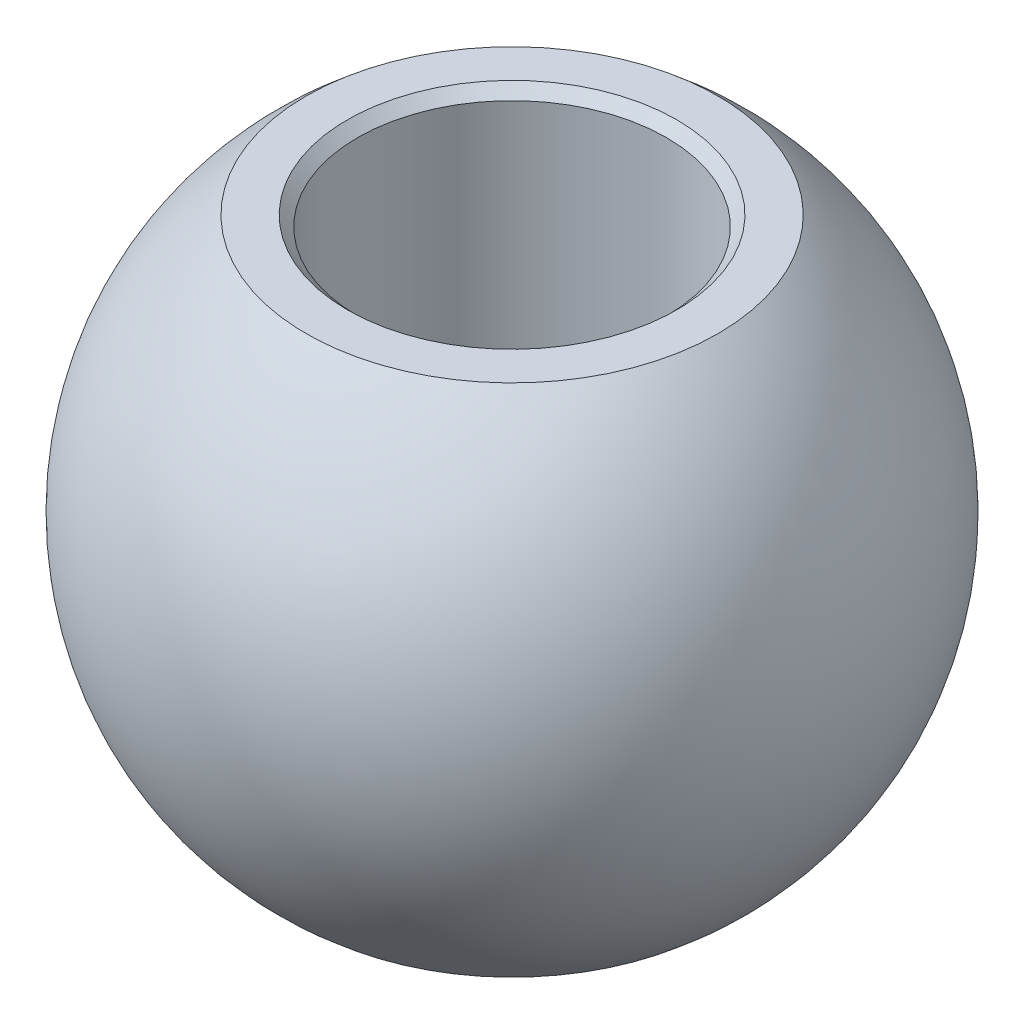
ISO-10303-21;
HEADER;
FILE_DESCRIPTION(('STEP AP214'),'2;1');
FILE_NAME('part.step','',(''),(''),'','','');
FILE_SCHEMA(('AUTOMOTIVE_DESIGN { 1 0 10303 214 1 1 1 1 }'));
ENDSEC;
DATA;
#1=APPLICATION_CONTEXT('core data for automotive mechanical design processes');
#2=APPLICATION_PROTOCOL_DEFINITION('international standard','automotive_design',2000,#1);
#3=PRODUCT_CONTEXT('',#1,'mechanical');
#4=PRODUCT('Part','Part','',(#3));
#5=PRODUCT_RELATED_PRODUCT_CATEGORY('part','',(#4));
#6=PRODUCT_DEFINITION_FORMATION('','',#4);
#7=PRODUCT_DEFINITION_CONTEXT('part definition',#1,'design');
#8=PRODUCT_DEFINITION('design','',#6,#7);
#9=PRODUCT_DEFINITION_SHAPE('','',#8);
#10=(LENGTH_UNIT() NAMED_UNIT(*) SI_UNIT(.MILLI.,.METRE.));
#11=(NAMED_UNIT(*) PLANE_ANGLE_UNIT() SI_UNIT($,.RADIAN.));
#12=(NAMED_UNIT(*) SI_UNIT($,.STERADIAN.) SOLID_ANGLE_UNIT());
#13=UNCERTAINTY_MEASURE_WITH_UNIT(LENGTH_MEASURE(1.E-05),#10,'distance_accuracy_value','');
#14=(GEOMETRIC_REPRESENTATION_CONTEXT(3) GLOBAL_UNCERTAINTY_ASSIGNED_CONTEXT((#13)) GLOBAL_UNIT_ASSIGNED_CONTEXT((#10,
#11,#12)) REPRESENTATION_CONTEXT('',''));
#15=CARTESIAN_POINT('',(0.,0.,0.));
#16=DIRECTION('',(0.,0.,1.));
#17=DIRECTION('',(1.,0.,0.));
#18=AXIS2_PLACEMENT_3D('',#15,#16,#17);
#19=CARTESIAN_POINT('',(0.,0.,0.));
#20=DIRECTION('',(0.,1.,0.));
#21=DIRECTION('',(0.,0.,1.));
#22=AXIS2_PLACEMENT_3D('',#19,#20,#21);
#23=PLANE('',#22);
#24=CARTESIAN_POINT('',(0.,0.,0.));
#25=DIRECTION('',(0.,1.,0.));
#26=DIRECTION('',(0.,0.,1.));
#27=AXIS2_PLACEMENT_3D('',#24,#25,#26);
#28=CIRCLE('',#27,1.6);
#29=CARTESIAN_POINT('',(0.,0.,-1.6));
#30=VERTEX_POINT('',#29);
#31=EDGE_CURVE('E10',#30,#30,#28,.T.);
#32=ORIENTED_EDGE('',*,*,#31,.T.);
#33=EDGE_LOOP('',(#32));
#34=FACE_BOUND('',#33,.T.);
#35=CARTESIAN_POINT('',(0.,0.,0.));
#36=DIRECTION('',(0.,1.,0.));
#37=DIRECTION('',(0.,0.,1.));
#38=AXIS2_PLACEMENT_3D('',#35,#36,#37);
#39=CIRCLE('',#38,2.);
#40=CARTESIAN_POINT('',(2.,0.,0.));
#41=VERTEX_POINT('',#40);
#42=EDGE_CURVE('E50',#41,#41,#39,.T.);
#43=ORIENTED_EDGE('',*,*,#42,.F.);
#44=EDGE_LOOP('',(#43));
#45=FACE_BOUND('',#44,.T.);
#46=ADVANCED_FACE('F30',(#34,#45),#23,.F.);
#47=CARTESIAN_POINT('',(0.,2.5,0.));
#48=DIRECTION('',(0.,1.,0.));
#49=DIRECTION('',(1.,0.,0.));
#50=AXIS2_PLACEMENT_3D('',#47,#48,#49);
#51=SPHERICAL_SURFACE('',#50,3.20156211871642);
#52=CARTESIAN_POINT('',(0.,5.,0.));
#53=DIRECTION('',(0.,1.,0.));
#54=DIRECTION('',(0.,0.,1.));
#55=AXIS2_PLACEMENT_3D('',#52,#53,#54);
#56=CIRCLE('',#55,2.);
#57=CARTESIAN_POINT('',(2.,5.,0.));
#58=VERTEX_POINT('',#57);
#59=EDGE_CURVE('E53',#58,#58,#56,.T.);
#60=CARTESIAN_POINT('',(2.,5.,0.));
#61=CARTESIAN_POINT('',(2.04667080680688,4.96266576471709,0.));
#62=CARTESIAN_POINT('',(2.09229369871325,4.9240219283492,0.));
#63=CARTESIAN_POINT('',(2.18130612201967,4.84424238607713,0.));
#64=CARTESIAN_POINT('',(2.22469565341971,4.80310668017295,0.));
#65=CARTESIAN_POINT('',(2.30910382500815,4.71847073146198,0.));
#66=CARTESIAN_POINT('',(2.35012246519655,4.67497048865518,0.));
#67=CARTESIAN_POINT('',(2.42966063415613,4.58574230654031,0.));
#68=CARTESIAN_POINT('',(2.46818016292731,4.54001436723223,0.));
#69=CARTESIAN_POINT('',(2.54259922219851,4.44647405663133,0.));
#70=CARTESIAN_POINT('',(2.57849875269853,4.3986616853385,0.));
#71=CARTESIAN_POINT('',(2.64756527847642,4.30110246147674,0.));
#72=CARTESIAN_POINT('',(2.68073227375429,4.25135560890782,0.));
#73=CARTESIAN_POINT('',(2.74422972408889,4.15008339862375,0.));
#74=CARTESIAN_POINT('',(2.77456017914562,4.0985580409086,0.));
#75=CARTESIAN_POINT('',(2.83228944787627,3.99389038387791,0.));
#76=CARTESIAN_POINT('',(2.85968826155019,3.94074808456236,0.));
#77=CARTESIAN_POINT('',(2.9114683361229,3.83301317501538,0.));
#78=CARTESIAN_POINT('',(2.93584959702169,3.77842056478395,0.));
#79=CARTESIAN_POINT('',(2.98151811708827,3.66795621241311,0.));
#80=CARTESIAN_POINT('',(3.00280537625608,3.61208447027371,0.));
#81=CARTESIAN_POINT('',(3.04221914517177,3.49923704369237,0.));
#82=CARTESIAN_POINT('',(3.06034565491965,3.44226135925043,0.));
#83=CARTESIAN_POINT('',(3.09338108810127,3.32738469921129,0.));
#84=CARTESIAN_POINT('',(3.10829001153502,3.26948372361409,0.));
#85=CARTESIAN_POINT('',(3.13484352414164,3.15293803371017,0.));
#86=CARTESIAN_POINT('',(3.14648811331451,3.09429331940346,0.));
#87=CARTESIAN_POINT('',(3.16647644499843,2.97644403657359,0.));
#88=CARTESIAN_POINT('',(3.17482018750947,2.91723946805043,0.));
#89=CARTESIAN_POINT('',(3.18818066349712,2.79845611674067,0.));
#90=CARTESIAN_POINT('',(3.19319739697372,2.73887733395406,0.));
#91=CARTESIAN_POINT('',(3.19988812458338,2.61953236744497,0.));
#92=CARTESIAN_POINT('',(3.20156211871642,2.55976618372248,0.));
#93=CARTESIAN_POINT('',(3.20156211871642,2.44023381627751,0.));
#94=CARTESIAN_POINT('',(3.19988812458338,2.38046763255503,0.));
#95=CARTESIAN_POINT('',(3.19319739697372,2.26112266604594,0.));
#96=CARTESIAN_POINT('',(3.18818066349712,2.20154388325933,0.));
#97=CARTESIAN_POINT('',(3.17482018750947,2.08276053194957,0.));
#98=CARTESIAN_POINT('',(3.16647644499843,2.02355596342641,0.));
#99=CARTESIAN_POINT('',(3.14648811331451,1.90570668059654,0.));
#100=CARTESIAN_POINT('',(3.13484352414164,1.84706196628982,0.));
#101=CARTESIAN_POINT('',(3.10829001153502,1.73051627638591,0.));
#102=CARTESIAN_POINT('',(3.09338108810127,1.67261530078871,0.));
#103=CARTESIAN_POINT('',(3.06034565491965,1.55773864074957,0.));
#104=CARTESIAN_POINT('',(3.04221914517177,1.50076295630763,0.));
#105=CARTESIAN_POINT('',(3.00280537625608,1.38791552972629,0.));
#106=CARTESIAN_POINT('',(2.98151811708827,1.33204378758689,0.));
#107=CARTESIAN_POINT('',(2.93584959702168,1.22157943521605,0.));
#108=CARTESIAN_POINT('',(2.9114683361229,1.16698682498462,0.));
#109=CARTESIAN_POINT('',(2.85968826155019,1.05925191543764,0.));
#110=CARTESIAN_POINT('',(2.83228944787627,1.00610961612209,0.));
#111=CARTESIAN_POINT('',(2.77456017914561,0.901441959091396,0.));
#112=CARTESIAN_POINT('',(2.74422972408889,0.849916601376249,0.));
#113=CARTESIAN_POINT('',(2.68073227375429,0.748644391092179,0.));
#114=CARTESIAN_POINT('',(2.64756527847642,0.698897538523255,0.));
#115=CARTESIAN_POINT('',(2.57849875269852,0.601338314661502,0.));
#116=CARTESIAN_POINT('',(2.54259922219851,0.553525943368672,0.));
#117=CARTESIAN_POINT('',(2.46818016292731,0.459985632767766,0.));
#118=CARTESIAN_POINT('',(2.42966063415612,0.41425769345969,0.));
#119=CARTESIAN_POINT('',(2.35012246519655,0.325029511344817,0.));
#120=CARTESIAN_POINT('',(2.30910382500815,0.281529268538019,0.));
#121=CARTESIAN_POINT('',(2.22469565341971,0.196893319827044,0.));
#122=CARTESIAN_POINT('',(2.18130612201966,0.155757613922866,0.));
#123=CARTESIAN_POINT('',(2.09229369871325,0.075978071650799,0.));
#124=CARTESIAN_POINT('',(2.04667080680687,0.0373342352829097,0.));
#125=CARTESIAN_POINT('',(2.,0.,0.));
#126=B_SPLINE_CURVE_WITH_KNOTS('',3,(#60,#61,#62,#63,#64,#65,#66,#67,#68,#69,#70,#71,#72,#73,
#74,#75,#76,#77,#78,#79,#80,#81,#82,#83,#84,#85,#86,#87,#88,#89,#90,#91,#92,#93,#94,#95,#96,#97,
#98,#99,#100,#101,#102,#103,#104,#105,#106,#107,#108,#109,#110,#111,#112,#113,#114,#115,#116,
#117,#118,#119,#120,#121,#122,#123,#124,#125),.UNSPECIFIED.,.F.,.F.,(4,2,2,2,2,2,2,2,2,2,2,2,2,
2,2,2,2,2,2,2,2,2,2,2,2,2,2,2,2,2,2,2,4),(0.,0.17927513064657,0.358550261293141,
0.537825391939711,0.717100522586283,0.896375653232853,1.07565078387942,1.254925914526,
1.43420104517257,1.61347617581914,1.79275130646571,1.97202643711228,2.15130156775885,
2.33057669840542,2.50985182905199,2.68912695969856,2.86840209034513,3.0476772209917,
3.22695235163827,3.40622748228484,3.58550261293142,3.76477774357799,3.94405287422456,
4.12332800487113,4.3026031355177,4.48187826616427,4.66115339681084,4.84042852745741,
5.01970365810398,5.19897878875055,5.37825391939712,5.55752905004369,5.73680418069026),.UNSPECIFIED.);
#127=EDGE_CURVE('BSEAM59',#58,#41,#126,.T.);
#128=ORIENTED_EDGE('',*,*,#59,.F.);
#129=ORIENTED_EDGE('',*,*,#42,.T.);
#130=ORIENTED_EDGE('',*,*,#127,.T.);
#131=ORIENTED_EDGE('',*,*,#127,.F.);
#132=EDGE_LOOP('',(#128,#130,#129,#131));
#133=FACE_BOUND('',#132,.T.);
#134=ADVANCED_FACE('F59',(#133),#51,.T.);
#135=CARTESIAN_POINT('',(0.,5.,0.));
#136=DIRECTION('',(0.,-1.,0.));
#137=DIRECTION('',(0.,0.,-1.));
#138=AXIS2_PLACEMENT_3D('',#135,#136,#137);
#139=PLANE('',#138);
#140=CARTESIAN_POINT('',(0.,5.,0.));
#141=DIRECTION('',(0.,-1.,0.));
#142=DIRECTION('',(0.,0.,-1.));
#143=AXIS2_PLACEMENT_3D('',#140,#141,#142);
#144=CIRCLE('',#143,1.6);
#145=CARTESIAN_POINT('',(0.,5.,-1.6));
#146=VERTEX_POINT('',#145);
#147=EDGE_CURVE('E37',#146,#146,#144,.T.);
#148=ORIENTED_EDGE('',*,*,#147,.T.);
#149=EDGE_LOOP('',(#148));
#150=FACE_BOUND('',#149,.T.);
#151=ORIENTED_EDGE('',*,*,#59,.T.);
#152=EDGE_LOOP('',(#151));
#153=FACE_BOUND('',#152,.T.);
#154=ADVANCED_FACE('F57',(#150,#153),#139,.F.);
#155=CARTESIAN_POINT('',(0.,0.,0.));
#156=DIRECTION('',(0.,1.,0.));
#157=DIRECTION('',(0.,0.,1.));
#158=AXIS2_PLACEMENT_3D('',#155,#156,#157);
#159=CYLINDRICAL_SURFACE('',#158,1.5);
#160=CARTESIAN_POINT('',(0.,4.9,0.));
#161=DIRECTION('',(0.,-1.,0.));
#162=DIRECTION('',(0.,0.,-1.));
#163=AXIS2_PLACEMENT_3D('',#160,#161,#162);
#164=CIRCLE('',#163,1.5);
#165=CARTESIAN_POINT('',(0.,4.9,-1.5));
#166=VERTEX_POINT('',#165);
#167=EDGE_CURVE('E41',#166,#166,#164,.F.);
#168=ORIENTED_EDGE('',*,*,#167,.T.);
#169=EDGE_LOOP('',(#168));
#170=FACE_BOUND('',#169,.T.);
#171=CARTESIAN_POINT('',(0.,0.0999999999999994,0.));
#172=DIRECTION('',(0.,1.,0.));
#173=DIRECTION('',(0.,0.,1.));
#174=AXIS2_PLACEMENT_3D('',#171,#172,#173);
#175=CIRCLE('',#174,1.5);
#176=CARTESIAN_POINT('',(0.,0.0999999999999994,-1.5));
#177=VERTEX_POINT('',#176);
#178=EDGE_CURVE('E45',#177,#177,#175,.F.);
#179=ORIENTED_EDGE('',*,*,#178,.T.);
#180=EDGE_LOOP('',(#179));
#181=FACE_BOUND('',#180,.T.);
#182=ADVANCED_FACE('F72',(#170,#181),#159,.F.);
#183=CARTESIAN_POINT('',(0.,4.9,0.));
#184=DIRECTION('',(0.,1.,0.));
#185=DIRECTION('',(0.,0.,1.));
#186=AXIS2_PLACEMENT_3D('',#183,#184,#185);
#187=CONICAL_SURFACE('',#186,1.5,0.785398163397441);
#188=ORIENTED_EDGE('',*,*,#147,.F.);
#189=EDGE_LOOP('',(#188));
#190=FACE_BOUND('',#189,.T.);
#191=ORIENTED_EDGE('',*,*,#167,.F.);
#192=EDGE_LOOP('',(#191));
#193=FACE_BOUND('',#192,.T.);
#194=ADVANCED_FACE('F70',(#190,#193),#187,.F.);
#195=CARTESIAN_POINT('',(0.,0.,0.));
#196=DIRECTION('',(0.,-1.,0.));
#197=DIRECTION('',(0.,0.,-1.));
#198=AXIS2_PLACEMENT_3D('',#195,#196,#197);
#199=CONICAL_SURFACE('',#198,1.6,0.785398163397446);
#200=CARTESIAN_POINT('',(0.,0.0999999999999994,-1.5));
#201=CARTESIAN_POINT('',(0.,0.0989583333333327,-1.50104166666667));
#202=CARTESIAN_POINT('',(0.,0.097916666666666,-1.50208333333333));
#203=CARTESIAN_POINT('',(0.,0.0958333333333328,-1.50416666666667));
#204=CARTESIAN_POINT('',(0.,0.0947916666666661,-1.50520833333333));
#205=CARTESIAN_POINT('',(0.,0.0927083333333328,-1.50729166666667));
#206=CARTESIAN_POINT('',(0.,0.0916666666666661,-1.50833333333333));
#207=CARTESIAN_POINT('',(0.,0.0895833333333327,-1.51041666666667));
#208=CARTESIAN_POINT('',(0.,0.0885416666666661,-1.51145833333333));
#209=CARTESIAN_POINT('',(0.,0.0864583333333328,-1.51354166666667));
#210=CARTESIAN_POINT('',(0.,0.0854166666666661,-1.51458333333333));
#211=CARTESIAN_POINT('',(0.,0.0833333333333327,-1.51666666666667));
#212=CARTESIAN_POINT('',(0.,0.0822916666666661,-1.51770833333333));
#213=CARTESIAN_POINT('',(0.,0.0802083333333328,-1.51979166666667));
#214=CARTESIAN_POINT('',(0.,0.0791666666666661,-1.52083333333333));
#215=CARTESIAN_POINT('',(0.,0.0770833333333328,-1.52291666666667));
#216=CARTESIAN_POINT('',(0.,0.0760416666666661,-1.52395833333333));
#217=CARTESIAN_POINT('',(0.,0.0739583333333328,-1.52604166666667));
#218=CARTESIAN_POINT('',(0.,0.0729166666666661,-1.52708333333333));
#219=CARTESIAN_POINT('',(0.,0.0708333333333328,-1.52916666666667));
#220=CARTESIAN_POINT('',(0.,0.0697916666666661,-1.53020833333333));
#221=CARTESIAN_POINT('',(0.,0.0677083333333328,-1.53229166666667));
#222=CARTESIAN_POINT('',(0.,0.0666666666666661,-1.53333333333333));
#223=CARTESIAN_POINT('',(0.,0.0645833333333328,-1.53541666666667));
#224=CARTESIAN_POINT('',(0.,0.0635416666666661,-1.53645833333333));
#225=CARTESIAN_POINT('',(0.,0.0614583333333328,-1.53854166666667));
#226=CARTESIAN_POINT('',(0.,0.0604166666666661,-1.53958333333333));
#227=CARTESIAN_POINT('',(0.,0.0583333333333328,-1.54166666666667));
#228=CARTESIAN_POINT('',(0.,0.0572916666666662,-1.54270833333333));
#229=CARTESIAN_POINT('',(0.,0.0552083333333328,-1.54479166666667));
#230=CARTESIAN_POINT('',(0.,0.0541666666666661,-1.54583333333333));
#231=CARTESIAN_POINT('',(0.,0.0520833333333328,-1.54791666666667));
#232=CARTESIAN_POINT('',(0.,0.0510416666666662,-1.54895833333333));
#233=CARTESIAN_POINT('',(0.,0.0489583333333328,-1.55104166666667));
#234=CARTESIAN_POINT('',(0.,0.0479166666666661,-1.55208333333333));
#235=CARTESIAN_POINT('',(0.,0.0458333333333328,-1.55416666666667));
#236=CARTESIAN_POINT('',(0.,0.0447916666666662,-1.55520833333333));
#237=CARTESIAN_POINT('',(0.,0.0427083333333328,-1.55729166666667));
#238=CARTESIAN_POINT('',(0.,0.0416666666666662,-1.55833333333333));
#239=CARTESIAN_POINT('',(0.,0.0395833333333328,-1.56041666666667));
#240=CARTESIAN_POINT('',(0.,0.0385416666666662,-1.56145833333333));
#241=CARTESIAN_POINT('',(0.,0.0364583333333329,-1.56354166666667));
#242=CARTESIAN_POINT('',(0.,0.0354166666666662,-1.56458333333333));
#243=CARTESIAN_POINT('',(0.,0.0333333333333328,-1.56666666666667));
#244=CARTESIAN_POINT('',(0.,0.0322916666666662,-1.56770833333333));
#245=CARTESIAN_POINT('',(0.,0.0302083333333329,-1.56979166666667));
#246=CARTESIAN_POINT('',(0.,0.0291666666666662,-1.57083333333333));
#247=CARTESIAN_POINT('',(0.,0.0270833333333328,-1.57291666666667));
#248=CARTESIAN_POINT('',(0.,0.0260416666666662,-1.57395833333333));
#249=CARTESIAN_POINT('',(0.,0.0239583333333329,-1.57604166666667));
#250=CARTESIAN_POINT('',(0.,0.0229166666666662,-1.57708333333333));
#251=CARTESIAN_POINT('',(0.,0.0208333333333329,-1.57916666666667));
#252=CARTESIAN_POINT('',(0.,0.0197916666666662,-1.58020833333333));
#253=CARTESIAN_POINT('',(0.,0.0177083333333329,-1.58229166666667));
#254=CARTESIAN_POINT('',(0.,0.0166666666666662,-1.58333333333333));
#255=CARTESIAN_POINT('',(0.,0.0145833333333329,-1.58541666666667));
#256=CARTESIAN_POINT('',(0.,0.0135416666666662,-1.58645833333333));
#257=CARTESIAN_POINT('',(0.,0.0114583333333329,-1.58854166666667));
#258=CARTESIAN_POINT('',(0.,0.0104166666666662,-1.58958333333333));
#259=CARTESIAN_POINT('',(0.,0.0083333333333329,-1.59166666666667));
#260=CARTESIAN_POINT('',(0.,0.00729166666666621,-1.59270833333333));
#261=CARTESIAN_POINT('',(0.,0.00520833333333287,-1.59479166666667));
#262=CARTESIAN_POINT('',(0.,0.00416666666666622,-1.59583333333333));
#263=CARTESIAN_POINT('',(0.,0.00208333333333293,-1.59791666666667));
#264=CARTESIAN_POINT('',(0.,0.00104166666666629,-1.59895833333333));
#265=CARTESIAN_POINT('',(0.,0.,-1.6));
#266=B_SPLINE_CURVE_WITH_KNOTS('',3,(#200,#201,#202,#203,#204,#205,#206,#207,#208,#209,#210,
#211,#212,#213,#214,#215,#216,#217,#218,#219,#220,#221,#222,#223,#224,#225,#226,#227,#228,#229,
#230,#231,#232,#233,#234,#235,#236,#237,#238,#239,#240,#241,#242,#243,#244,#245,#246,#247,#248,
#249,#250,#251,#252,#253,#254,#255,#256,#257,#258,#259,#260,#261,#262,#263,#264,#265),
.UNSPECIFIED.,.F.,.F.,(4,2,2,2,2,2,2,2,2,2,2,2,2,2,2,2,2,2,2,2,2,2,2,2,2,2,2,2,2,2,2,2,4),(0.,
0.00441941738241583,0.00883883476483181,0.0132582521472476,0.0176776695296636,
0.0220970869120794,0.0265165042944954,0.0309359216769114,0.0353553390593272,0.0397747564417431,
0.044194173824159,0.048613591206575,0.0530330085889909,0.0574524259714067,0.0618718433538227,
0.0662912607362385,0.0707106781186545,0.0751300955010703,0.0795495128834863,0.0839689302659021,
0.0883883476483181,0.0928077650307339,0.0972271824131499,0.101646599795566,0.106066017177982,
0.110485434560398,0.114904851942814,0.11932426932523,0.123743686707645,0.128163104090061,
0.132582521472477,0.137001938854893,0.141421356237309),.UNSPECIFIED.);
#267=EDGE_CURVE('BSEAM32',#177,#30,#266,.T.);
#268=ORIENTED_EDGE('',*,*,#178,.F.);
#269=ORIENTED_EDGE('',*,*,#31,.F.);
#270=ORIENTED_EDGE('',*,*,#267,.T.);
#271=ORIENTED_EDGE('',*,*,#267,.F.);
#272=EDGE_LOOP('',(#268,#270,#269,#271));
#273=FACE_BOUND('',#272,.T.);
#274=ADVANCED_FACE('F32',(#273),#199,.F.);
#275=CLOSED_SHELL('',(#46,#134,#154,#182,#194,#274));
#276=MANIFOLD_SOLID_BREP('B2',#275);
#277=ADVANCED_BREP_SHAPE_REPRESENTATION('',(#18,#276),#14);
#278=SHAPE_DEFINITION_REPRESENTATION(#9,#277);
ENDSEC;
END-ISO-10303-21;
